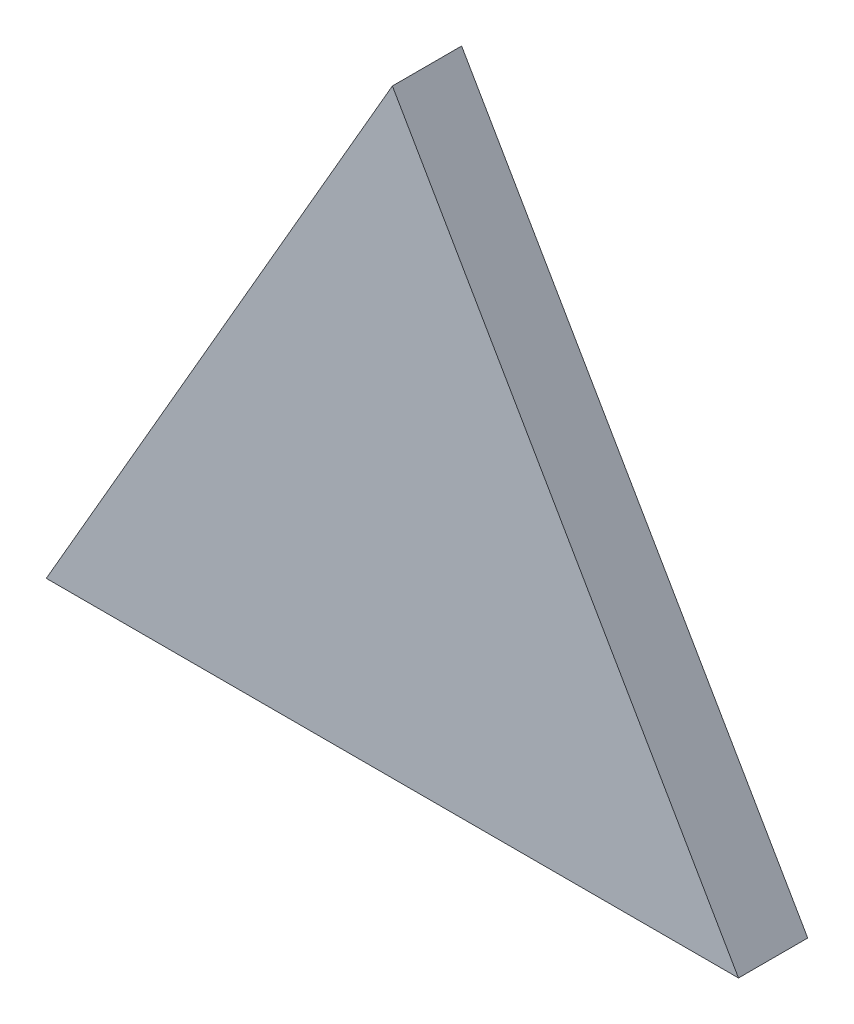
ISO-10303-21;
HEADER;
FILE_DESCRIPTION(('STEP AP214'),'2;1');
FILE_NAME('part.step','',(''),(''),'','','');
FILE_SCHEMA(('AUTOMOTIVE_DESIGN { 1 0 10303 214 1 1 1 1 }'));
ENDSEC;
DATA;
#1=APPLICATION_CONTEXT('core data for automotive mechanical design processes');
#2=APPLICATION_PROTOCOL_DEFINITION('international standard','automotive_design',2000,#1);
#3=PRODUCT_CONTEXT('',#1,'mechanical');
#4=PRODUCT('Part','Part','',(#3));
#5=PRODUCT_RELATED_PRODUCT_CATEGORY('part','',(#4));
#6=PRODUCT_DEFINITION_FORMATION('','',#4);
#7=PRODUCT_DEFINITION_CONTEXT('part definition',#1,'design');
#8=PRODUCT_DEFINITION('design','',#6,#7);
#9=PRODUCT_DEFINITION_SHAPE('','',#8);
#10=(LENGTH_UNIT() NAMED_UNIT(*) SI_UNIT(.MILLI.,.METRE.));
#11=(NAMED_UNIT(*) PLANE_ANGLE_UNIT() SI_UNIT($,.RADIAN.));
#12=(NAMED_UNIT(*) SI_UNIT($,.STERADIAN.) SOLID_ANGLE_UNIT());
#13=UNCERTAINTY_MEASURE_WITH_UNIT(LENGTH_MEASURE(1.E-05),#10,'distance_accuracy_value','');
#14=(GEOMETRIC_REPRESENTATION_CONTEXT(3) GLOBAL_UNCERTAINTY_ASSIGNED_CONTEXT((#13)) GLOBAL_UNIT_ASSIGNED_CONTEXT((#10,
#11,#12)) REPRESENTATION_CONTEXT('',''));
#15=CARTESIAN_POINT('',(0.,0.,0.));
#16=DIRECTION('',(0.,0.,1.));
#17=DIRECTION('',(1.,0.,0.));
#18=AXIS2_PLACEMENT_3D('',#15,#16,#17);
#19=CARTESIAN_POINT('',(63.5,-36.6617420935412,12.7));
#20=DIRECTION('',(-0.866025403784438,-0.5,0.));
#21=DIRECTION('',(0.5,-0.866025403784439,0.));
#22=AXIS2_PLACEMENT_3D('',#19,#20,#21);
#23=PLANE('',#22);
#24=DIRECTION('',(-0.5,0.866025403784438,0.));
#25=VECTOR('',#24,1.);
#26=CARTESIAN_POINT('',(63.5,-36.6617420935412,0.));
#27=LINE('',#26,#25);
#28=CARTESIAN_POINT('',(63.5,-36.6617420935412,0.));
#29=VERTEX_POINT('',#28);
#30=CARTESIAN_POINT('',(0.,73.3234841870824,0.));
#31=VERTEX_POINT('',#30);
#32=EDGE_CURVE('E79',#29,#31,#27,.T.);
#33=ORIENTED_EDGE('',*,*,#32,.T.);
#34=DIRECTION('',(0.,0.,-1.));
#35=VECTOR('',#34,1.);
#36=CARTESIAN_POINT('',(0.,73.3234841870824,12.7));
#37=LINE('',#36,#35);
#38=CARTESIAN_POINT('',(0.,73.3234841870824,12.7));
#39=VERTEX_POINT('',#38);
#40=EDGE_CURVE('E11',#39,#31,#37,.T.);
#41=ORIENTED_EDGE('',*,*,#40,.F.);
#42=DIRECTION('',(-0.5,0.866025403784438,0.));
#43=VECTOR('',#42,1.);
#44=CARTESIAN_POINT('',(63.5,-36.6617420935412,12.7));
#45=LINE('',#44,#43);
#46=CARTESIAN_POINT('',(63.5,-36.6617420935412,12.7));
#47=VERTEX_POINT('',#46);
#48=EDGE_CURVE('E72',#47,#39,#45,.T.);
#49=ORIENTED_EDGE('',*,*,#48,.F.);
#50=DIRECTION('',(0.,0.,-1.));
#51=VECTOR('',#50,1.);
#52=CARTESIAN_POINT('',(63.5,-36.6617420935412,12.7));
#53=LINE('',#52,#51);
#54=EDGE_CURVE('E80',#47,#29,#53,.T.);
#55=ORIENTED_EDGE('',*,*,#54,.T.);
#56=EDGE_LOOP('',(#33,#41,#49,#55));
#57=FACE_BOUND('',#56,.T.);
#58=ADVANCED_FACE('F32',(#57),#23,.F.);
#59=CARTESIAN_POINT('',(0.,73.3234841870824,12.7));
#60=DIRECTION('',(0.866025403784438,-0.5,0.));
#61=DIRECTION('',(0.5,0.866025403784439,0.));
#62=AXIS2_PLACEMENT_3D('',#59,#60,#61);
#63=PLANE('',#62);
#64=DIRECTION('',(-0.5,-0.866025403784438,0.));
#65=VECTOR('',#64,1.);
#66=CARTESIAN_POINT('',(0.,73.3234841870824,0.));
#67=LINE('',#66,#65);
#68=CARTESIAN_POINT('',(-63.5,-36.6617420935413,0.));
#69=VERTEX_POINT('',#68);
#70=EDGE_CURVE('E60',#31,#69,#67,.T.);
#71=ORIENTED_EDGE('',*,*,#70,.T.);
#72=DIRECTION('',(0.,0.,-1.));
#73=VECTOR('',#72,1.);
#74=CARTESIAN_POINT('',(-63.5,-36.6617420935413,12.7));
#75=LINE('',#74,#73);
#76=CARTESIAN_POINT('',(-63.5,-36.6617420935413,12.7));
#77=VERTEX_POINT('',#76);
#78=EDGE_CURVE('E40',#77,#69,#75,.T.);
#79=ORIENTED_EDGE('',*,*,#78,.F.);
#80=DIRECTION('',(-0.5,-0.866025403784438,0.));
#81=VECTOR('',#80,1.);
#82=CARTESIAN_POINT('',(0.,73.3234841870824,12.7));
#83=LINE('',#82,#81);
#84=EDGE_CURVE('E68',#39,#77,#83,.T.);
#85=ORIENTED_EDGE('',*,*,#84,.F.);
#86=ORIENTED_EDGE('',*,*,#40,.T.);
#87=EDGE_LOOP('',(#71,#79,#85,#86));
#88=FACE_BOUND('',#87,.T.);
#89=ADVANCED_FACE('F69',(#88),#63,.F.);
#90=CARTESIAN_POINT('',(-63.5,-36.6617420935413,12.7));
#91=DIRECTION('',(0.,1.,0.));
#92=DIRECTION('',(-1.,0.,0.));
#93=AXIS2_PLACEMENT_3D('',#90,#91,#92);
#94=PLANE('',#93);
#95=DIRECTION('',(1.,0.,0.));
#96=VECTOR('',#95,1.);
#97=CARTESIAN_POINT('',(-63.5,-36.6617420935413,0.));
#98=LINE('',#97,#96);
#99=EDGE_CURVE('E65',#69,#29,#98,.T.);
#100=ORIENTED_EDGE('',*,*,#99,.T.);
#101=ORIENTED_EDGE('',*,*,#54,.F.);
#102=DIRECTION('',(1.,0.,0.));
#103=VECTOR('',#102,1.);
#104=CARTESIAN_POINT('',(-63.5,-36.6617420935413,12.7));
#105=LINE('',#104,#103);
#106=EDGE_CURVE('E48',#77,#47,#105,.T.);
#107=ORIENTED_EDGE('',*,*,#106,.F.);
#108=ORIENTED_EDGE('',*,*,#78,.T.);
#109=EDGE_LOOP('',(#100,#101,#107,#108));
#110=FACE_BOUND('',#109,.T.);
#111=ADVANCED_FACE('F87',(#110),#94,.F.);
#112=CARTESIAN_POINT('',(0.,0.,12.7));
#113=DIRECTION('',(0.,0.,1.));
#114=DIRECTION('',(1.,0.,0.));
#115=AXIS2_PLACEMENT_3D('',#112,#113,#114);
#116=PLANE('',#115);
#117=ORIENTED_EDGE('',*,*,#48,.T.);
#118=ORIENTED_EDGE('',*,*,#84,.T.);
#119=ORIENTED_EDGE('',*,*,#106,.T.);
#120=EDGE_LOOP('',(#117,#118,#119));
#121=FACE_BOUND('',#120,.T.);
#122=ADVANCED_FACE('F75',(#121),#116,.T.);
#123=CARTESIAN_POINT('',(0.,0.,0.));
#124=DIRECTION('',(0.,0.,1.));
#125=DIRECTION('',(1.,0.,0.));
#126=AXIS2_PLACEMENT_3D('',#123,#124,#125);
#127=PLANE('',#126);
#128=ORIENTED_EDGE('',*,*,#32,.F.);
#129=ORIENTED_EDGE('',*,*,#99,.F.);
#130=ORIENTED_EDGE('',*,*,#70,.F.);
#131=EDGE_LOOP('',(#128,#129,#130));
#132=FACE_BOUND('',#131,.T.);
#133=ADVANCED_FACE('F88',(#132),#127,.F.);
#134=CLOSED_SHELL('',(#58,#89,#111,#122,#133));
#135=MANIFOLD_SOLID_BREP('B2',#134);
#136=ADVANCED_BREP_SHAPE_REPRESENTATION('',(#18,#135),#14);
#137=SHAPE_DEFINITION_REPRESENTATION(#9,#136);
ENDSEC;
END-ISO-10303-21;
